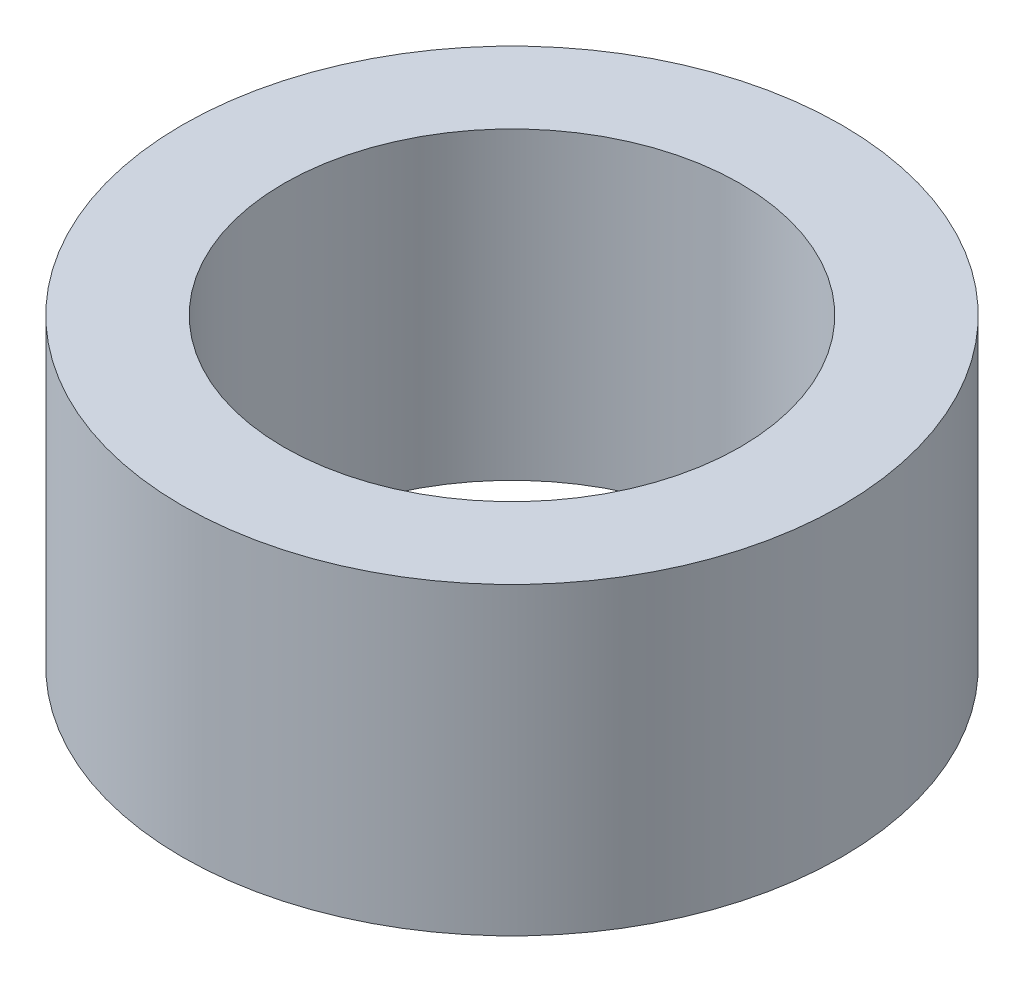
ISO-10303-21;
HEADER;
FILE_DESCRIPTION(('STEP AP214'),'2;1');
FILE_NAME('part.step','',(''),(''),'','','');
FILE_SCHEMA(('AUTOMOTIVE_DESIGN { 1 0 10303 214 1 1 1 1 }'));
ENDSEC;
DATA;
#1=APPLICATION_CONTEXT('core data for automotive mechanical design processes');
#2=APPLICATION_PROTOCOL_DEFINITION('international standard','automotive_design',2000,#1);
#3=PRODUCT_CONTEXT('',#1,'mechanical');
#4=PRODUCT('Part','Part','',(#3));
#5=PRODUCT_RELATED_PRODUCT_CATEGORY('part','',(#4));
#6=PRODUCT_DEFINITION_FORMATION('','',#4);
#7=PRODUCT_DEFINITION_CONTEXT('part definition',#1,'design');
#8=PRODUCT_DEFINITION('design','',#6,#7);
#9=PRODUCT_DEFINITION_SHAPE('','',#8);
#10=(LENGTH_UNIT() NAMED_UNIT(*) SI_UNIT(.MILLI.,.METRE.));
#11=(NAMED_UNIT(*) PLANE_ANGLE_UNIT() SI_UNIT($,.RADIAN.));
#12=(NAMED_UNIT(*) SI_UNIT($,.STERADIAN.) SOLID_ANGLE_UNIT());
#13=UNCERTAINTY_MEASURE_WITH_UNIT(LENGTH_MEASURE(1.E-05),#10,'distance_accuracy_value','');
#14=(GEOMETRIC_REPRESENTATION_CONTEXT(3) GLOBAL_UNCERTAINTY_ASSIGNED_CONTEXT((#13)) GLOBAL_UNIT_ASSIGNED_CONTEXT((#10,
#11,#12)) REPRESENTATION_CONTEXT('',''));
#15=CARTESIAN_POINT('',(0.,0.,0.));
#16=DIRECTION('',(0.,0.,1.));
#17=DIRECTION('',(1.,0.,0.));
#18=AXIS2_PLACEMENT_3D('',#15,#16,#17);
#19=CARTESIAN_POINT('',(0.,3.,0.));
#20=DIRECTION('',(0.,1.,0.));
#21=DIRECTION('',(0.,0.,1.));
#22=AXIS2_PLACEMENT_3D('',#19,#20,#21);
#23=PLANE('',#22);
#24=CARTESIAN_POINT('',(0.,3.,0.));
#25=DIRECTION('',(0.,1.,0.));
#26=DIRECTION('',(0.,0.,1.));
#27=AXIS2_PLACEMENT_3D('',#24,#25,#26);
#28=CIRCLE('',#27,3.25);
#29=CARTESIAN_POINT('',(0.,3.,3.25));
#30=VERTEX_POINT('',#29);
#31=EDGE_CURVE('E10',#30,#30,#28,.T.);
#32=ORIENTED_EDGE('',*,*,#31,.T.);
#33=EDGE_LOOP('',(#32));
#34=FACE_BOUND('',#33,.T.);
#35=CARTESIAN_POINT('',(0.,3.,0.));
#36=DIRECTION('',(0.,1.,0.));
#37=DIRECTION('',(0.,0.,1.));
#38=AXIS2_PLACEMENT_3D('',#35,#36,#37);
#39=CIRCLE('',#38,2.25);
#40=CARTESIAN_POINT('',(0.,3.,2.25));
#41=VERTEX_POINT('',#40);
#42=EDGE_CURVE('E43',#41,#41,#39,.T.);
#43=ORIENTED_EDGE('',*,*,#42,.F.);
#44=EDGE_LOOP('',(#43));
#45=FACE_BOUND('',#44,.T.);
#46=ADVANCED_FACE('F32',(#34,#45),#23,.T.);
#47=CARTESIAN_POINT('',(0.,0.,0.));
#48=DIRECTION('',(0.,1.,0.));
#49=DIRECTION('',(0.,0.,1.));
#50=AXIS2_PLACEMENT_3D('',#47,#48,#49);
#51=PLANE('',#50);
#52=CARTESIAN_POINT('',(0.,0.,0.));
#53=DIRECTION('',(0.,1.,0.));
#54=DIRECTION('',(0.,0.,1.));
#55=AXIS2_PLACEMENT_3D('',#52,#53,#54);
#56=CIRCLE('',#55,3.25);
#57=CARTESIAN_POINT('',(0.,0.,3.25));
#58=VERTEX_POINT('',#57);
#59=EDGE_CURVE('E36',#58,#58,#56,.T.);
#60=ORIENTED_EDGE('',*,*,#59,.F.);
#61=EDGE_LOOP('',(#60));
#62=FACE_BOUND('',#61,.T.);
#63=CARTESIAN_POINT('',(0.,0.,0.));
#64=DIRECTION('',(0.,1.,0.));
#65=DIRECTION('',(0.,0.,1.));
#66=AXIS2_PLACEMENT_3D('',#63,#64,#65);
#67=CIRCLE('',#66,2.25);
#68=CARTESIAN_POINT('',(0.,0.,2.25));
#69=VERTEX_POINT('',#68);
#70=EDGE_CURVE('E45',#69,#69,#67,.T.);
#71=ORIENTED_EDGE('',*,*,#70,.T.);
#72=EDGE_LOOP('',(#71));
#73=FACE_BOUND('',#72,.T.);
#74=ADVANCED_FACE('F55',(#62,#73),#51,.F.);
#75=CARTESIAN_POINT('',(0.,3.,0.));
#76=DIRECTION('',(0.,-1.,0.));
#77=DIRECTION('',(0.,0.,-1.));
#78=AXIS2_PLACEMENT_3D('',#75,#76,#77);
#79=CYLINDRICAL_SURFACE('',#78,3.25);
#80=ORIENTED_EDGE('',*,*,#31,.F.);
#81=EDGE_LOOP('',(#80));
#82=FACE_BOUND('',#81,.T.);
#83=ORIENTED_EDGE('',*,*,#59,.T.);
#84=EDGE_LOOP('',(#83));
#85=FACE_BOUND('',#84,.T.);
#86=ADVANCED_FACE('F34',(#82,#85),#79,.T.);
#87=CARTESIAN_POINT('',(0.,3.,0.));
#88=DIRECTION('',(0.,-1.,0.));
#89=DIRECTION('',(0.,0.,-1.));
#90=AXIS2_PLACEMENT_3D('',#87,#88,#89);
#91=CYLINDRICAL_SURFACE('',#90,2.25);
#92=ORIENTED_EDGE('',*,*,#42,.T.);
#93=EDGE_LOOP('',(#92));
#94=FACE_BOUND('',#93,.T.);
#95=ORIENTED_EDGE('',*,*,#70,.F.);
#96=EDGE_LOOP('',(#95));
#97=FACE_BOUND('',#96,.T.);
#98=ADVANCED_FACE('F51',(#94,#97),#91,.F.);
#99=CLOSED_SHELL('',(#46,#74,#86,#98));
#100=MANIFOLD_SOLID_BREP('B2',#99);
#101=ADVANCED_BREP_SHAPE_REPRESENTATION('',(#18,#100),#14);
#102=SHAPE_DEFINITION_REPRESENTATION(#9,#101);
ENDSEC;
END-ISO-10303-21;
